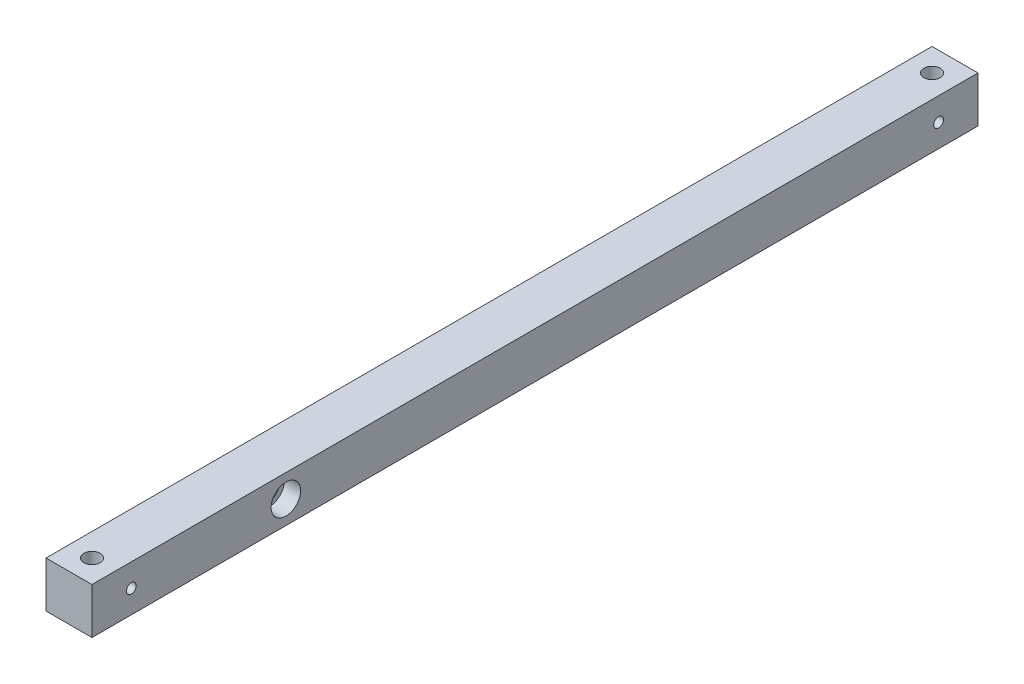
ISO-10303-21;
HEADER;
FILE_DESCRIPTION(('STEP AP214'),'2;1');
FILE_NAME('part.step','',(''),(''),'','','');
FILE_SCHEMA(('AUTOMOTIVE_DESIGN { 1 0 10303 214 1 1 1 1 }'));
ENDSEC;
DATA;
#1=APPLICATION_CONTEXT('core data for automotive mechanical design processes');
#2=APPLICATION_PROTOCOL_DEFINITION('international standard','automotive_design',2000,#1);
#3=PRODUCT_CONTEXT('',#1,'mechanical');
#4=PRODUCT('Part','Part','',(#3));
#5=PRODUCT_RELATED_PRODUCT_CATEGORY('part','',(#4));
#6=PRODUCT_DEFINITION_FORMATION('','',#4);
#7=PRODUCT_DEFINITION_CONTEXT('part definition',#1,'design');
#8=PRODUCT_DEFINITION('design','',#6,#7);
#9=PRODUCT_DEFINITION_SHAPE('','',#8);
#10=(LENGTH_UNIT() NAMED_UNIT(*) SI_UNIT(.MILLI.,.METRE.));
#11=(NAMED_UNIT(*) PLANE_ANGLE_UNIT() SI_UNIT($,.RADIAN.));
#12=(NAMED_UNIT(*) SI_UNIT($,.STERADIAN.) SOLID_ANGLE_UNIT());
#13=UNCERTAINTY_MEASURE_WITH_UNIT(LENGTH_MEASURE(1.E-05),#10,'distance_accuracy_value','');
#14=(GEOMETRIC_REPRESENTATION_CONTEXT(3) GLOBAL_UNCERTAINTY_ASSIGNED_CONTEXT((#13)) GLOBAL_UNIT_ASSIGNED_CONTEXT((#10,
#11,#12)) REPRESENTATION_CONTEXT('',''));
#15=CARTESIAN_POINT('',(0.,0.,0.));
#16=DIRECTION('',(0.,0.,1.));
#17=DIRECTION('',(1.,0.,0.));
#18=AXIS2_PLACEMENT_3D('',#15,#16,#17);
#19=CARTESIAN_POINT('',(-14.001,0.,246.));
#20=DIRECTION('',(1.,0.,0.));
#21=DIRECTION('',(0.,0.,-1.));
#22=AXIS2_PLACEMENT_3D('',#19,#20,#21);
#23=CYLINDRICAL_SURFACE('',#22,3.00000000000005);
#24=CARTESIAN_POINT('',(14.,0.,246.));
#25=DIRECTION('',(1.,0.,0.));
#26=DIRECTION('',(0.,0.,-1.));
#27=AXIS2_PLACEMENT_3D('',#24,#25,#26);
#28=CIRCLE('',#27,3.00000000000005);
#29=CARTESIAN_POINT('',(14.,0.,243.));
#30=VERTEX_POINT('',#29);
#31=EDGE_CURVE('E133',#30,#30,#28,.T.);
#32=ORIENTED_EDGE('',*,*,#31,.T.);
#33=EDGE_LOOP('',(#32));
#34=FACE_BOUND('',#33,.T.);
#35=CARTESIAN_POINT('',(-7.,0.,246.));
#36=DIRECTION('',(-1.,0.,0.));
#37=DIRECTION('',(0.,0.,1.));
#38=AXIS2_PLACEMENT_3D('',#35,#36,#37);
#39=CIRCLE('',#38,3.00000000000005);
#40=CARTESIAN_POINT('',(-7.,0.,249.));
#41=VERTEX_POINT('',#40);
#42=EDGE_CURVE('E130',#41,#41,#39,.F.);
#43=ORIENTED_EDGE('',*,*,#42,.F.);
#44=EDGE_LOOP('',(#43));
#45=FACE_BOUND('',#44,.T.);
#46=ADVANCED_FACE('F35',(#34,#45),#23,.F.);
#47=CARTESIAN_POINT('',(-14.001,0.,-246.));
#48=DIRECTION('',(1.,0.,0.));
#49=DIRECTION('',(0.,0.,-1.));
#50=AXIS2_PLACEMENT_3D('',#47,#48,#49);
#51=CYLINDRICAL_SURFACE('',#50,2.99999999999999);
#52=CARTESIAN_POINT('',(14.,0.,-246.));
#53=DIRECTION('',(1.,0.,0.));
#54=DIRECTION('',(0.,0.,-1.));
#55=AXIS2_PLACEMENT_3D('',#52,#53,#54);
#56=CIRCLE('',#55,2.99999999999999);
#57=CARTESIAN_POINT('',(14.,0.,-249.));
#58=VERTEX_POINT('',#57);
#59=EDGE_CURVE('E137',#58,#58,#56,.T.);
#60=ORIENTED_EDGE('',*,*,#59,.T.);
#61=EDGE_LOOP('',(#60));
#62=FACE_BOUND('',#61,.T.);
#63=CARTESIAN_POINT('',(-7.,0.,-246.));
#64=DIRECTION('',(-1.,0.,0.));
#65=DIRECTION('',(0.,0.,1.));
#66=AXIS2_PLACEMENT_3D('',#63,#64,#65);
#67=CIRCLE('',#66,2.99999999999999);
#68=CARTESIAN_POINT('',(-7.,0.,-243.));
#69=VERTEX_POINT('',#68);
#70=EDGE_CURVE('E128',#69,#69,#67,.F.);
#71=ORIENTED_EDGE('',*,*,#70,.F.);
#72=EDGE_LOOP('',(#71));
#73=FACE_BOUND('',#72,.T.);
#74=ADVANCED_FACE('F183',(#62,#73),#51,.F.);
#75=CARTESIAN_POINT('',(-14.,0.,151.8));
#76=DIRECTION('',(1.,0.,0.));
#77=DIRECTION('',(0.,0.,-1.));
#78=AXIS2_PLACEMENT_3D('',#75,#76,#77);
#79=CYLINDRICAL_SURFACE('',#78,5.99999999999999);
#80=CARTESIAN_POINT('',(-14.,0.,151.8));
#81=DIRECTION('',(1.,0.,0.));
#82=DIRECTION('',(0.,0.,-1.));
#83=AXIS2_PLACEMENT_3D('',#80,#81,#82);
#84=CIRCLE('',#83,5.99999999999999);
#85=CARTESIAN_POINT('',(-14.,0.,145.8));
#86=VERTEX_POINT('',#85);
#87=EDGE_CURVE('E126',#86,#86,#84,.T.);
#88=ORIENTED_EDGE('',*,*,#87,.F.);
#89=EDGE_LOOP('',(#88));
#90=FACE_BOUND('',#89,.T.);
#91=CARTESIAN_POINT('',(4.,0.,151.8));
#92=DIRECTION('',(1.,0.,0.));
#93=DIRECTION('',(0.,0.,-1.));
#94=AXIS2_PLACEMENT_3D('',#91,#92,#93);
#95=CIRCLE('',#94,5.99999999999999);
#96=CARTESIAN_POINT('',(4.,0.,145.8));
#97=VERTEX_POINT('',#96);
#98=EDGE_CURVE('E123',#97,#97,#95,.F.);
#99=ORIENTED_EDGE('',*,*,#98,.F.);
#100=EDGE_LOOP('',(#99));
#101=FACE_BOUND('',#100,.T.);
#102=ADVANCED_FACE('F179',(#90,#101),#79,.F.);
#103=CARTESIAN_POINT('',(14.,-14.,270.));
#104=DIRECTION('',(-1.,0.,0.));
#105=DIRECTION('',(0.,0.,1.));
#106=AXIS2_PLACEMENT_3D('',#103,#104,#105);
#107=PLANE('',#106);
#108=ORIENTED_EDGE('',*,*,#59,.F.);
#109=EDGE_LOOP('',(#108));
#110=FACE_BOUND('',#109,.T.);
#111=ORIENTED_EDGE('',*,*,#31,.F.);
#112=EDGE_LOOP('',(#111));
#113=FACE_BOUND('',#112,.T.);
#114=CARTESIAN_POINT('',(14.,0.,151.8));
#115=DIRECTION('',(1.,0.,0.));
#116=DIRECTION('',(0.,0.,-1.));
#117=AXIS2_PLACEMENT_3D('',#114,#115,#116);
#118=CIRCLE('',#117,8.99999999999998);
#119=CARTESIAN_POINT('',(14.,0.,142.8));
#120=VERTEX_POINT('',#119);
#121=EDGE_CURVE('E142',#120,#120,#118,.T.);
#122=ORIENTED_EDGE('',*,*,#121,.F.);
#123=EDGE_LOOP('',(#122));
#124=FACE_BOUND('',#123,.T.);
#125=DIRECTION('',(0.,1.,0.));
#126=VECTOR('',#125,1.);
#127=CARTESIAN_POINT('',(14.,-14.,-270.));
#128=LINE('',#127,#126);
#129=CARTESIAN_POINT('',(14.,-14.,-270.));
#130=VERTEX_POINT('',#129);
#131=CARTESIAN_POINT('',(14.,14.,-270.));
#132=VERTEX_POINT('',#131);
#133=EDGE_CURVE('E106',#130,#132,#128,.T.);
#134=ORIENTED_EDGE('',*,*,#133,.T.);
#135=DIRECTION('',(0.,0.,-1.));
#136=VECTOR('',#135,1.);
#137=CARTESIAN_POINT('',(14.,14.,270.));
#138=LINE('',#137,#136);
#139=CARTESIAN_POINT('',(14.,14.,270.));
#140=VERTEX_POINT('',#139);
#141=EDGE_CURVE('E11',#140,#132,#138,.T.);
#142=ORIENTED_EDGE('',*,*,#141,.F.);
#143=DIRECTION('',(0.,1.,0.));
#144=VECTOR('',#143,1.);
#145=CARTESIAN_POINT('',(14.,-14.,270.));
#146=LINE('',#145,#144);
#147=CARTESIAN_POINT('',(14.,-14.,270.));
#148=VERTEX_POINT('',#147);
#149=EDGE_CURVE('E93',#148,#140,#146,.T.);
#150=ORIENTED_EDGE('',*,*,#149,.F.);
#151=DIRECTION('',(0.,0.,-1.));
#152=VECTOR('',#151,1.);
#153=CARTESIAN_POINT('',(14.,-14.,270.));
#154=LINE('',#153,#152);
#155=EDGE_CURVE('E102',#148,#130,#154,.T.);
#156=ORIENTED_EDGE('',*,*,#155,.T.);
#157=EDGE_LOOP('',(#134,#142,#150,#156));
#158=FACE_BOUND('',#157,.T.);
#159=ADVANCED_FACE('F37',(#110,#113,#124,#158),#107,.F.);
#160=CARTESIAN_POINT('',(-14.,14.,270.));
#161=DIRECTION('',(0.,-1.,0.));
#162=DIRECTION('',(0.,0.,-1.));
#163=AXIS2_PLACEMENT_3D('',#160,#161,#162);
#164=PLANE('',#163);
#165=CARTESIAN_POINT('',(0.,14.,-256.));
#166=DIRECTION('',(0.,1.,0.));
#167=DIRECTION('',(0.,0.,1.));
#168=AXIS2_PLACEMENT_3D('',#165,#166,#167);
#169=CIRCLE('',#168,5.00000000000001);
#170=CARTESIAN_POINT('',(0.,14.,-251.));
#171=VERTEX_POINT('',#170);
#172=EDGE_CURVE('E159',#171,#171,#169,.T.);
#173=ORIENTED_EDGE('',*,*,#172,.F.);
#174=EDGE_LOOP('',(#173));
#175=FACE_BOUND('',#174,.T.);
#176=CARTESIAN_POINT('',(0.,14.,256.));
#177=DIRECTION('',(0.,1.,0.));
#178=DIRECTION('',(0.,0.,1.));
#179=AXIS2_PLACEMENT_3D('',#176,#177,#178);
#180=CIRCLE('',#179,5.00000000000001);
#181=CARTESIAN_POINT('',(0.,14.,261.));
#182=VERTEX_POINT('',#181);
#183=EDGE_CURVE('E122',#182,#182,#180,.T.);
#184=ORIENTED_EDGE('',*,*,#183,.F.);
#185=EDGE_LOOP('',(#184));
#186=FACE_BOUND('',#185,.T.);
#187=DIRECTION('',(-1.,0.,0.));
#188=VECTOR('',#187,1.);
#189=CARTESIAN_POINT('',(-14.,14.,-270.));
#190=LINE('',#189,#188);
#191=CARTESIAN_POINT('',(-14.,14.,-270.));
#192=VERTEX_POINT('',#191);
#193=EDGE_CURVE('E97',#132,#192,#190,.T.);
#194=ORIENTED_EDGE('',*,*,#193,.T.);
#195=DIRECTION('',(0.,0.,-1.));
#196=VECTOR('',#195,1.);
#197=CARTESIAN_POINT('',(-14.,14.,270.));
#198=LINE('',#197,#196);
#199=CARTESIAN_POINT('',(-14.,14.,270.));
#200=VERTEX_POINT('',#199);
#201=EDGE_CURVE('E49',#200,#192,#198,.T.);
#202=ORIENTED_EDGE('',*,*,#201,.F.);
#203=DIRECTION('',(-1.,0.,0.));
#204=VECTOR('',#203,1.);
#205=CARTESIAN_POINT('',(-14.,14.,270.));
#206=LINE('',#205,#204);
#207=EDGE_CURVE('E88',#140,#200,#206,.T.);
#208=ORIENTED_EDGE('',*,*,#207,.F.);
#209=ORIENTED_EDGE('',*,*,#141,.T.);
#210=EDGE_LOOP('',(#194,#202,#208,#209));
#211=FACE_BOUND('',#210,.T.);
#212=ADVANCED_FACE('F96',(#175,#186,#211),#164,.F.);
#213=CARTESIAN_POINT('',(-14.,-14.,270.));
#214=DIRECTION('',(1.,0.,0.));
#215=DIRECTION('',(0.,0.,-1.));
#216=AXIS2_PLACEMENT_3D('',#213,#214,#215);
#217=PLANE('',#216);
#218=CARTESIAN_POINT('',(-14.,0.,116.8));
#219=DIRECTION('',(-1.,0.,0.));
#220=DIRECTION('',(0.,0.,1.));
#221=AXIS2_PLACEMENT_3D('',#218,#219,#220);
#222=CIRCLE('',#221,6.);
#223=CARTESIAN_POINT('',(-14.,0.,122.8));
#224=VERTEX_POINT('',#223);
#225=EDGE_CURVE('E262',#224,#224,#222,.T.);
#226=ORIENTED_EDGE('',*,*,#225,.F.);
#227=EDGE_LOOP('',(#226));
#228=FACE_BOUND('',#227,.T.);
#229=CARTESIAN_POINT('',(-14.,0.,246.));
#230=DIRECTION('',(-1.,0.,0.));
#231=DIRECTION('',(0.,0.,1.));
#232=AXIS2_PLACEMENT_3D('',#229,#230,#231);
#233=CIRCLE('',#232,5.00000000000002);
#234=CARTESIAN_POINT('',(-14.,0.,251.));
#235=VERTEX_POINT('',#234);
#236=EDGE_CURVE('E268',#235,#235,#233,.T.);
#237=ORIENTED_EDGE('',*,*,#236,.F.);
#238=EDGE_LOOP('',(#237));
#239=FACE_BOUND('',#238,.T.);
#240=CARTESIAN_POINT('',(-14.,0.,-246.));
#241=DIRECTION('',(-1.,0.,0.));
#242=DIRECTION('',(0.,0.,1.));
#243=AXIS2_PLACEMENT_3D('',#240,#241,#242);
#244=CIRCLE('',#243,4.99999999999999);
#245=CARTESIAN_POINT('',(-14.,0.,-241.));
#246=VERTEX_POINT('',#245);
#247=EDGE_CURVE('E273',#246,#246,#244,.T.);
#248=ORIENTED_EDGE('',*,*,#247,.F.);
#249=EDGE_LOOP('',(#248));
#250=FACE_BOUND('',#249,.T.);
#251=ORIENTED_EDGE('',*,*,#87,.T.);
#252=EDGE_LOOP('',(#251));
#253=FACE_BOUND('',#252,.T.);
#254=DIRECTION('',(0.,-1.,0.));
#255=VECTOR('',#254,1.);
#256=CARTESIAN_POINT('',(-14.,-14.,-270.));
#257=LINE('',#256,#255);
#258=CARTESIAN_POINT('',(-14.,-14.,-270.));
#259=VERTEX_POINT('',#258);
#260=EDGE_CURVE('E75',#192,#259,#257,.T.);
#261=ORIENTED_EDGE('',*,*,#260,.T.);
#262=DIRECTION('',(0.,0.,-1.));
#263=VECTOR('',#262,1.);
#264=CARTESIAN_POINT('',(-14.,-14.,270.));
#265=LINE('',#264,#263);
#266=CARTESIAN_POINT('',(-14.,-14.,270.));
#267=VERTEX_POINT('',#266);
#268=EDGE_CURVE('E98',#267,#259,#265,.T.);
#269=ORIENTED_EDGE('',*,*,#268,.F.);
#270=DIRECTION('',(0.,-1.,0.));
#271=VECTOR('',#270,1.);
#272=CARTESIAN_POINT('',(-14.,-14.,270.));
#273=LINE('',#272,#271);
#274=EDGE_CURVE('E91',#200,#267,#273,.T.);
#275=ORIENTED_EDGE('',*,*,#274,.F.);
#276=ORIENTED_EDGE('',*,*,#201,.T.);
#277=EDGE_LOOP('',(#261,#269,#275,#276));
#278=FACE_BOUND('',#277,.T.);
#279=ADVANCED_FACE('F100',(#228,#239,#250,#253,#278),#217,.F.);
#280=CARTESIAN_POINT('',(-14.,-14.,270.));
#281=DIRECTION('',(0.,1.,0.));
#282=DIRECTION('',(0.,0.,1.));
#283=AXIS2_PLACEMENT_3D('',#280,#281,#282);
#284=PLANE('',#283);
#285=CARTESIAN_POINT('',(-2.,-14.,116.8));
#286=DIRECTION('',(0.,-1.,0.));
#287=DIRECTION('',(0.,0.,-1.));
#288=AXIS2_PLACEMENT_3D('',#285,#286,#287);
#289=CIRCLE('',#288,2.5);
#290=CARTESIAN_POINT('',(-2.,-14.,114.3));
#291=VERTEX_POINT('',#290);
#292=EDGE_CURVE('E241',#291,#291,#289,.T.);
#293=ORIENTED_EDGE('',*,*,#292,.F.);
#294=EDGE_LOOP('',(#293));
#295=FACE_BOUND('',#294,.T.);
#296=CARTESIAN_POINT('',(0.,-14.,193.8));
#297=DIRECTION('',(0.,-1.,0.));
#298=DIRECTION('',(0.,0.,-1.));
#299=AXIS2_PLACEMENT_3D('',#296,#297,#298);
#300=CIRCLE('',#299,3.);
#301=CARTESIAN_POINT('',(0.,-14.,190.8));
#302=VERTEX_POINT('',#301);
#303=EDGE_CURVE('E245',#302,#302,#300,.T.);
#304=ORIENTED_EDGE('',*,*,#303,.F.);
#305=EDGE_LOOP('',(#304));
#306=FACE_BOUND('',#305,.T.);
#307=CARTESIAN_POINT('',(0.,-14.,106.8));
#308=DIRECTION('',(0.,-1.,0.));
#309=DIRECTION('',(0.,0.,-1.));
#310=AXIS2_PLACEMENT_3D('',#307,#308,#309);
#311=CIRCLE('',#310,3.);
#312=CARTESIAN_POINT('',(0.,-14.,103.8));
#313=VERTEX_POINT('',#312);
#314=EDGE_CURVE('E249',#313,#313,#311,.T.);
#315=ORIENTED_EDGE('',*,*,#314,.F.);
#316=EDGE_LOOP('',(#315));
#317=FACE_BOUND('',#316,.T.);
#318=CARTESIAN_POINT('',(0.,-14.,256.));
#319=DIRECTION('',(0.,1.,0.));
#320=DIRECTION('',(0.,0.,1.));
#321=AXIS2_PLACEMENT_3D('',#318,#319,#320);
#322=CIRCLE('',#321,3.);
#323=CARTESIAN_POINT('',(0.,-14.,259.));
#324=VERTEX_POINT('',#323);
#325=EDGE_CURVE('E119',#324,#324,#322,.T.);
#326=ORIENTED_EDGE('',*,*,#325,.T.);
#327=EDGE_LOOP('',(#326));
#328=FACE_BOUND('',#327,.T.);
#329=CARTESIAN_POINT('',(0.,-14.,-256.));
#330=DIRECTION('',(0.,1.,0.));
#331=DIRECTION('',(0.,0.,1.));
#332=AXIS2_PLACEMENT_3D('',#329,#330,#331);
#333=CIRCLE('',#332,3.);
#334=CARTESIAN_POINT('',(0.,-14.,-253.));
#335=VERTEX_POINT('',#334);
#336=EDGE_CURVE('E152',#335,#335,#333,.T.);
#337=ORIENTED_EDGE('',*,*,#336,.T.);
#338=EDGE_LOOP('',(#337));
#339=FACE_BOUND('',#338,.T.);
#340=DIRECTION('',(1.,0.,0.));
#341=VECTOR('',#340,1.);
#342=CARTESIAN_POINT('',(-14.,-14.,-270.));
#343=LINE('',#342,#341);
#344=EDGE_CURVE('E81',#259,#130,#343,.T.);
#345=ORIENTED_EDGE('',*,*,#344,.T.);
#346=ORIENTED_EDGE('',*,*,#155,.F.);
#347=DIRECTION('',(1.,0.,0.));
#348=VECTOR('',#347,1.);
#349=CARTESIAN_POINT('',(-14.,-14.,270.));
#350=LINE('',#349,#348);
#351=EDGE_CURVE('E58',#267,#148,#350,.T.);
#352=ORIENTED_EDGE('',*,*,#351,.F.);
#353=ORIENTED_EDGE('',*,*,#268,.T.);
#354=EDGE_LOOP('',(#345,#346,#352,#353));
#355=FACE_BOUND('',#354,.T.);
#356=ADVANCED_FACE('F176',(#295,#306,#317,#328,#339,#355),#284,.F.);
#357=CARTESIAN_POINT('',(0.,0.,270.));
#358=DIRECTION('',(0.,0.,-1.));
#359=DIRECTION('',(-1.,0.,0.));
#360=AXIS2_PLACEMENT_3D('',#357,#358,#359);
#361=PLANE('',#360);
#362=ORIENTED_EDGE('',*,*,#149,.T.);
#363=ORIENTED_EDGE('',*,*,#207,.T.);
#364=ORIENTED_EDGE('',*,*,#274,.T.);
#365=ORIENTED_EDGE('',*,*,#351,.T.);
#366=EDGE_LOOP('',(#362,#363,#364,#365));
#367=FACE_BOUND('',#366,.T.);
#368=ADVANCED_FACE('F89',(#367),#361,.F.);
#369=CARTESIAN_POINT('',(0.,0.,-270.));
#370=DIRECTION('',(0.,0.,-1.));
#371=DIRECTION('',(-1.,0.,0.));
#372=AXIS2_PLACEMENT_3D('',#369,#370,#371);
#373=PLANE('',#372);
#374=ORIENTED_EDGE('',*,*,#133,.F.);
#375=ORIENTED_EDGE('',*,*,#344,.F.);
#376=ORIENTED_EDGE('',*,*,#260,.F.);
#377=ORIENTED_EDGE('',*,*,#193,.F.);
#378=EDGE_LOOP('',(#374,#375,#376,#377));
#379=FACE_BOUND('',#378,.T.);
#380=ADVANCED_FACE('F227',(#379),#373,.T.);
#381=CARTESIAN_POINT('',(0.,7.,256.));
#382=DIRECTION('',(0.,1.,0.));
#383=DIRECTION('',(0.,0.,1.));
#384=AXIS2_PLACEMENT_3D('',#381,#382,#383);
#385=CYLINDRICAL_SURFACE('',#384,5.00000000000001);
#386=CARTESIAN_POINT('',(0.,7.,256.));
#387=DIRECTION('',(0.,1.,0.));
#388=DIRECTION('',(0.,0.,1.));
#389=AXIS2_PLACEMENT_3D('',#386,#387,#388);
#390=CIRCLE('',#389,5.00000000000001);
#391=CARTESIAN_POINT('',(0.,7.,261.));
#392=VERTEX_POINT('',#391);
#393=EDGE_CURVE('E162',#392,#392,#390,.T.);
#394=ORIENTED_EDGE('',*,*,#393,.F.);
#395=EDGE_LOOP('',(#394));
#396=FACE_BOUND('',#395,.T.);
#397=ORIENTED_EDGE('',*,*,#183,.T.);
#398=EDGE_LOOP('',(#397));
#399=FACE_BOUND('',#398,.T.);
#400=ADVANCED_FACE('F168',(#396,#399),#385,.F.);
#401=CARTESIAN_POINT('',(0.,7.,256.));
#402=DIRECTION('',(0.,1.,0.));
#403=DIRECTION('',(0.,0.,1.));
#404=AXIS2_PLACEMENT_3D('',#401,#402,#403);
#405=PLANE('',#404);
#406=CARTESIAN_POINT('',(0.,7.,256.));
#407=DIRECTION('',(0.,1.,0.));
#408=DIRECTION('',(0.,0.,1.));
#409=AXIS2_PLACEMENT_3D('',#406,#407,#408);
#410=CIRCLE('',#409,3.);
#411=CARTESIAN_POINT('',(0.,7.,259.));
#412=VERTEX_POINT('',#411);
#413=EDGE_CURVE('E118',#412,#412,#410,.T.);
#414=ORIENTED_EDGE('',*,*,#413,.F.);
#415=EDGE_LOOP('',(#414));
#416=FACE_BOUND('',#415,.T.);
#417=ORIENTED_EDGE('',*,*,#393,.T.);
#418=EDGE_LOOP('',(#417));
#419=FACE_BOUND('',#418,.T.);
#420=ADVANCED_FACE('F220',(#416,#419),#405,.T.);
#421=CARTESIAN_POINT('',(0.,7.,-256.));
#422=DIRECTION('',(0.,1.,0.));
#423=DIRECTION('',(0.,0.,1.));
#424=AXIS2_PLACEMENT_3D('',#421,#422,#423);
#425=CYLINDRICAL_SURFACE('',#424,5.00000000000001);
#426=CARTESIAN_POINT('',(0.,7.,-256.));
#427=DIRECTION('',(0.,1.,0.));
#428=DIRECTION('',(0.,0.,1.));
#429=AXIS2_PLACEMENT_3D('',#426,#427,#428);
#430=CIRCLE('',#429,5.00000000000001);
#431=CARTESIAN_POINT('',(0.,7.,-251.));
#432=VERTEX_POINT('',#431);
#433=EDGE_CURVE('E109',#432,#432,#430,.T.);
#434=ORIENTED_EDGE('',*,*,#433,.F.);
#435=EDGE_LOOP('',(#434));
#436=FACE_BOUND('',#435,.T.);
#437=ORIENTED_EDGE('',*,*,#172,.T.);
#438=EDGE_LOOP('',(#437));
#439=FACE_BOUND('',#438,.T.);
#440=ADVANCED_FACE('F216',(#436,#439),#425,.F.);
#441=CARTESIAN_POINT('',(0.,7.,-256.));
#442=DIRECTION('',(0.,1.,0.));
#443=DIRECTION('',(0.,0.,1.));
#444=AXIS2_PLACEMENT_3D('',#441,#442,#443);
#445=PLANE('',#444);
#446=CARTESIAN_POINT('',(0.,7.,-256.));
#447=DIRECTION('',(0.,1.,0.));
#448=DIRECTION('',(0.,0.,1.));
#449=AXIS2_PLACEMENT_3D('',#446,#447,#448);
#450=CIRCLE('',#449,3.);
#451=CARTESIAN_POINT('',(0.,7.,-253.));
#452=VERTEX_POINT('',#451);
#453=EDGE_CURVE('E115',#452,#452,#450,.T.);
#454=ORIENTED_EDGE('',*,*,#453,.F.);
#455=EDGE_LOOP('',(#454));
#456=FACE_BOUND('',#455,.T.);
#457=ORIENTED_EDGE('',*,*,#433,.T.);
#458=EDGE_LOOP('',(#457));
#459=FACE_BOUND('',#458,.T.);
#460=ADVANCED_FACE('F212',(#456,#459),#445,.T.);
#461=CARTESIAN_POINT('',(0.,-14.,-256.));
#462=DIRECTION('',(0.,1.,0.));
#463=DIRECTION('',(0.,0.,1.));
#464=AXIS2_PLACEMENT_3D('',#461,#462,#463);
#465=CYLINDRICAL_SURFACE('',#464,3.);
#466=ORIENTED_EDGE('',*,*,#453,.T.);
#467=EDGE_LOOP('',(#466));
#468=FACE_BOUND('',#467,.T.);
#469=ORIENTED_EDGE('',*,*,#336,.F.);
#470=EDGE_LOOP('',(#469));
#471=FACE_BOUND('',#470,.T.);
#472=ADVANCED_FACE('F208',(#468,#471),#465,.F.);
#473=CARTESIAN_POINT('',(0.,-14.,256.));
#474=DIRECTION('',(0.,1.,0.));
#475=DIRECTION('',(0.,0.,1.));
#476=AXIS2_PLACEMENT_3D('',#473,#474,#475);
#477=CYLINDRICAL_SURFACE('',#476,3.);
#478=ORIENTED_EDGE('',*,*,#413,.T.);
#479=EDGE_LOOP('',(#478));
#480=FACE_BOUND('',#479,.T.);
#481=ORIENTED_EDGE('',*,*,#325,.F.);
#482=EDGE_LOOP('',(#481));
#483=FACE_BOUND('',#482,.T.);
#484=ADVANCED_FACE('F197',(#480,#483),#477,.F.);
#485=CARTESIAN_POINT('',(4.,0.,151.8));
#486=DIRECTION('',(1.,0.,0.));
#487=DIRECTION('',(0.,0.,-1.));
#488=AXIS2_PLACEMENT_3D('',#485,#486,#487);
#489=PLANE('',#488);
#490=CARTESIAN_POINT('',(4.,0.,151.8));
#491=DIRECTION('',(1.,0.,0.));
#492=DIRECTION('',(0.,0.,-1.));
#493=AXIS2_PLACEMENT_3D('',#490,#491,#492);
#494=CIRCLE('',#493,8.99999999999998);
#495=CARTESIAN_POINT('',(4.,0.,142.8));
#496=VERTEX_POINT('',#495);
#497=EDGE_CURVE('E127',#496,#496,#494,.T.);
#498=ORIENTED_EDGE('',*,*,#497,.T.);
#499=EDGE_LOOP('',(#498));
#500=FACE_BOUND('',#499,.T.);
#501=ORIENTED_EDGE('',*,*,#98,.T.);
#502=EDGE_LOOP('',(#501));
#503=FACE_BOUND('',#502,.T.);
#504=ADVANCED_FACE('F193',(#500,#503),#489,.T.);
#505=CARTESIAN_POINT('',(4.,0.,151.8));
#506=DIRECTION('',(1.,0.,0.));
#507=DIRECTION('',(0.,0.,-1.));
#508=AXIS2_PLACEMENT_3D('',#505,#506,#507);
#509=CYLINDRICAL_SURFACE('',#508,8.99999999999998);
#510=ORIENTED_EDGE('',*,*,#497,.F.);
#511=EDGE_LOOP('',(#510));
#512=FACE_BOUND('',#511,.T.);
#513=ORIENTED_EDGE('',*,*,#121,.T.);
#514=EDGE_LOOP('',(#513));
#515=FACE_BOUND('',#514,.T.);
#516=ADVANCED_FACE('F196',(#512,#515),#509,.F.);
#517=CARTESIAN_POINT('',(-7.,0.,-246.));
#518=DIRECTION('',(-1.,0.,0.));
#519=DIRECTION('',(0.,0.,1.));
#520=AXIS2_PLACEMENT_3D('',#517,#518,#519);
#521=PLANE('',#520);
#522=CARTESIAN_POINT('',(-7.,0.,-246.));
#523=DIRECTION('',(-1.,0.,0.));
#524=DIRECTION('',(0.,0.,1.));
#525=AXIS2_PLACEMENT_3D('',#522,#523,#524);
#526=CIRCLE('',#525,4.99999999999999);
#527=CARTESIAN_POINT('',(-7.,0.,-241.));
#528=VERTEX_POINT('',#527);
#529=EDGE_CURVE('E271',#528,#528,#526,.T.);
#530=ORIENTED_EDGE('',*,*,#529,.T.);
#531=EDGE_LOOP('',(#530));
#532=FACE_BOUND('',#531,.T.);
#533=ORIENTED_EDGE('',*,*,#70,.T.);
#534=EDGE_LOOP('',(#533));
#535=FACE_BOUND('',#534,.T.);
#536=ADVANCED_FACE('F201',(#532,#535),#521,.T.);
#537=CARTESIAN_POINT('',(-7.,0.,-246.));
#538=DIRECTION('',(-1.,0.,0.));
#539=DIRECTION('',(0.,0.,1.));
#540=AXIS2_PLACEMENT_3D('',#537,#538,#539);
#541=CYLINDRICAL_SURFACE('',#540,4.99999999999999);
#542=ORIENTED_EDGE('',*,*,#529,.F.);
#543=EDGE_LOOP('',(#542));
#544=FACE_BOUND('',#543,.T.);
#545=ORIENTED_EDGE('',*,*,#247,.T.);
#546=EDGE_LOOP('',(#545));
#547=FACE_BOUND('',#546,.T.);
#548=ADVANCED_FACE('F323',(#544,#547),#541,.F.);
#549=CARTESIAN_POINT('',(-7.,0.,246.));
#550=DIRECTION('',(-1.,0.,0.));
#551=DIRECTION('',(0.,0.,1.));
#552=AXIS2_PLACEMENT_3D('',#549,#550,#551);
#553=PLANE('',#552);
#554=CARTESIAN_POINT('',(-7.,0.,246.));
#555=DIRECTION('',(-1.,0.,0.));
#556=DIRECTION('',(0.,0.,1.));
#557=AXIS2_PLACEMENT_3D('',#554,#555,#556);
#558=CIRCLE('',#557,5.00000000000002);
#559=CARTESIAN_POINT('',(-7.,0.,251.));
#560=VERTEX_POINT('',#559);
#561=EDGE_CURVE('E131',#560,#560,#558,.T.);
#562=ORIENTED_EDGE('',*,*,#561,.T.);
#563=EDGE_LOOP('',(#562));
#564=FACE_BOUND('',#563,.T.);
#565=ORIENTED_EDGE('',*,*,#42,.T.);
#566=EDGE_LOOP('',(#565));
#567=FACE_BOUND('',#566,.T.);
#568=ADVANCED_FACE('F320',(#564,#567),#553,.T.);
#569=CARTESIAN_POINT('',(-7.,0.,246.));
#570=DIRECTION('',(-1.,0.,0.));
#571=DIRECTION('',(0.,0.,1.));
#572=AXIS2_PLACEMENT_3D('',#569,#570,#571);
#573=CYLINDRICAL_SURFACE('',#572,5.00000000000002);
#574=ORIENTED_EDGE('',*,*,#561,.F.);
#575=EDGE_LOOP('',(#574));
#576=FACE_BOUND('',#575,.T.);
#577=ORIENTED_EDGE('',*,*,#236,.T.);
#578=EDGE_LOOP('',(#577));
#579=FACE_BOUND('',#578,.T.);
#580=ADVANCED_FACE('F318',(#576,#579),#573,.F.);
#581=CARTESIAN_POINT('',(0.,2.,106.8));
#582=DIRECTION('',(0.,-1.,0.));
#583=DIRECTION('',(0.,0.,-1.));
#584=AXIS2_PLACEMENT_3D('',#581,#582,#583);
#585=CYLINDRICAL_SURFACE('',#584,3.);
#586=CARTESIAN_POINT('',(0.,2.,106.8));
#587=DIRECTION('',(0.,-1.,0.));
#588=DIRECTION('',(0.,0.,-1.));
#589=AXIS2_PLACEMENT_3D('',#586,#587,#588);
#590=CIRCLE('',#589,3.);
#591=CARTESIAN_POINT('',(0.,2.,103.8));
#592=VERTEX_POINT('',#591);
#593=EDGE_CURVE('E256',#592,#592,#590,.T.);
#594=ORIENTED_EDGE('',*,*,#593,.F.);
#595=EDGE_LOOP('',(#594));
#596=FACE_BOUND('',#595,.T.);
#597=ORIENTED_EDGE('',*,*,#314,.T.);
#598=EDGE_LOOP('',(#597));
#599=FACE_BOUND('',#598,.T.);
#600=ADVANCED_FACE('F314',(#596,#599),#585,.F.);
#601=CARTESIAN_POINT('',(0.,2.,106.8));
#602=DIRECTION('',(0.,-1.,0.));
#603=DIRECTION('',(0.,0.,-1.));
#604=AXIS2_PLACEMENT_3D('',#601,#602,#603);
#605=PLANE('',#604);
#606=ORIENTED_EDGE('',*,*,#593,.T.);
#607=EDGE_LOOP('',(#606));
#608=FACE_BOUND('',#607,.T.);
#609=ADVANCED_FACE('F310',(#608),#605,.T.);
#610=CARTESIAN_POINT('',(0.,2.,193.8));
#611=DIRECTION('',(0.,-1.,0.));
#612=DIRECTION('',(0.,0.,-1.));
#613=AXIS2_PLACEMENT_3D('',#610,#611,#612);
#614=CYLINDRICAL_SURFACE('',#613,3.);
#615=CARTESIAN_POINT('',(0.,2.,193.8));
#616=DIRECTION('',(0.,-1.,0.));
#617=DIRECTION('',(0.,0.,-1.));
#618=AXIS2_PLACEMENT_3D('',#615,#616,#617);
#619=CIRCLE('',#618,3.);
#620=CARTESIAN_POINT('',(0.,2.,190.8));
#621=VERTEX_POINT('',#620);
#622=EDGE_CURVE('E275',#621,#621,#619,.T.);
#623=ORIENTED_EDGE('',*,*,#622,.F.);
#624=EDGE_LOOP('',(#623));
#625=FACE_BOUND('',#624,.T.);
#626=ORIENTED_EDGE('',*,*,#303,.T.);
#627=EDGE_LOOP('',(#626));
#628=FACE_BOUND('',#627,.T.);
#629=ADVANCED_FACE('F307',(#625,#628),#614,.F.);
#630=CARTESIAN_POINT('',(0.,2.,193.8));
#631=DIRECTION('',(0.,-1.,0.));
#632=DIRECTION('',(0.,0.,-1.));
#633=AXIS2_PLACEMENT_3D('',#630,#631,#632);
#634=PLANE('',#633);
#635=ORIENTED_EDGE('',*,*,#622,.T.);
#636=EDGE_LOOP('',(#635));
#637=FACE_BOUND('',#636,.T.);
#638=ADVANCED_FACE('F304',(#637),#634,.T.);
#639=CARTESIAN_POINT('',(6.,0.,116.8));
#640=DIRECTION('',(-1.,0.,0.));
#641=DIRECTION('',(0.,0.,1.));
#642=AXIS2_PLACEMENT_3D('',#639,#640,#641);
#643=CYLINDRICAL_SURFACE('',#642,6.);
#644=CARTESIAN_POINT('',(-2.,-5.45435605731786,114.3));
#645=CARTESIAN_POINT('',(-1.9332918168451,-5.45435734054166,114.300001499741));
#646=CARTESIAN_POINT('',(-1.86656520783146,-5.4555854329,114.302675504611));
#647=CARTESIAN_POINT('',(-1.73361352159701,-5.460451257595,114.313335835144));
#648=CARTESIAN_POINT('',(-1.66738876610491,-5.46409042196574,114.321325317898));
#649=CARTESIAN_POINT('',(-1.46994813322944,-5.47848490817198,114.353207340684));
#650=CARTESIAN_POINT('',(-1.34016318357051,-5.49271671920564,114.385013165918));
#651=CARTESIAN_POINT('',(-1.08884523586875,-5.52853615769556,114.468199986624));
#652=CARTESIAN_POINT('',(-0.967280947908397,-5.55009376241033,114.519501185614));
#653=CARTESIAN_POINT('',(-0.734489823443015,-5.59808356001865,114.639987310653));
#654=CARTESIAN_POINT('',(-0.623260550023206,-5.62451459938574,114.709168006235));
#655=CARTESIAN_POINT('',(-0.407346017910576,-5.68111508149861,114.868052215563));
#656=CARTESIAN_POINT('',(-0.303384202952535,-5.71141131571833,114.958693518509));
#657=CARTESIAN_POINT('',(-0.111600234825528,-5.77128595332677,115.155956653633));
#658=CARTESIAN_POINT('',(-0.023784304488851,-5.80086407614999,115.262584618652));
#659=CARTESIAN_POINT('',(0.136899255528637,-5.8575107455344,115.494473210945));
#660=CARTESIAN_POINT('',(0.208953307881459,-5.88441479600862,115.620341412242));
#661=CARTESIAN_POINT('',(0.330551989217485,-5.93113040336416,115.883735955666));
#662=CARTESIAN_POINT('',(0.38010661039742,-5.95094510785638,116.021257090358));
#663=CARTESIAN_POINT('',(0.45267893034036,-5.98035041998162,116.296463003853));
#664=CARTESIAN_POINT('',(0.476943393233222,-5.99041942231785,116.433766847582));
#665=CARTESIAN_POINT('',(0.502275278891982,-6.00093657245547,116.710841639296));
#666=CARTESIAN_POINT('',(0.503352110874229,-6.00138862268062,116.850611563536));
#667=CARTESIAN_POINT('',(0.482931438970794,-5.99290258260449,117.119585560219));
#668=CARTESIAN_POINT('',(0.462803799173118,-5.98453429295767,117.248914977213));
#669=CARTESIAN_POINT('',(0.402893794499093,-5.96013033502178,117.502165787865));
#670=CARTESIAN_POINT('',(0.363109980678849,-5.94409410149732,117.62608678211));
#671=CARTESIAN_POINT('',(0.264543918272477,-5.90559704827471,117.867276236154));
#672=CARTESIAN_POINT('',(0.205481074275769,-5.88304194251415,117.984414354149));
#673=CARTESIAN_POINT('',(0.0703084865819088,-5.83371427980367,118.207423534565));
#674=CARTESIAN_POINT('',(-0.00580728169784426,-5.80694023334947,118.313290595516));
#675=CARTESIAN_POINT('',(-0.17916484080079,-5.74963397551513,118.518681823413));
#676=CARTESIAN_POINT('',(-0.27751758254303,-5.71896988702082,118.617232874623));
#677=CARTESIAN_POINT('',(-0.489422881428128,-5.65875721372882,118.796862829865));
#678=CARTESIAN_POINT('',(-0.602981276635657,-5.62920906299902,118.877934991683));
#679=CARTESIAN_POINT('',(-0.846790073279715,-5.57363224672088,119.022803784971));
#680=CARTESIAN_POINT('',(-0.977466411305491,-5.54775116967603,119.085945066984));
#681=CARTESIAN_POINT('',(-1.24896208976256,-5.50419688296718,119.18892864104));
#682=CARTESIAN_POINT('',(-1.38977409648425,-5.48651780631503,119.228787592512));
#683=CARTESIAN_POINT('',(-1.667793617867,-5.46282425074792,119.281600503392));
#684=CARTESIAN_POINT('',(-1.80464224452852,-5.45612738403682,119.296132292665));
#685=CARTESIAN_POINT('',(-2.07895696481259,-5.45320573611839,119.302512610372));
#686=CARTESIAN_POINT('',(-2.21642282838074,-5.45697733196185,119.294368986361));
#687=CARTESIAN_POINT('',(-2.4787967708634,-5.47386262693795,119.257069551313));
#688=CARTESIAN_POINT('',(-2.60394537357419,-5.48636276033852,119.229292376362));
#689=CARTESIAN_POINT('',(-2.84770259299515,-5.51851260594277,119.155341171284));
#690=CARTESIAN_POINT('',(-2.96630967366157,-5.53816398920152,119.109162841062));
#691=CARTESIAN_POINT('',(-3.19923062071278,-5.58341595714178,118.997550416104));
#692=CARTESIAN_POINT('',(-3.31314994921936,-5.60923324404617,118.931383666124));
#693=CARTESIAN_POINT('',(-3.52881610499933,-5.66360007481535,118.782401568772));
#694=CARTESIAN_POINT('',(-3.63055763340873,-5.69215079841133,118.699579015752));
#695=CARTESIAN_POINT('',(-3.82760026976261,-5.75157239569102,118.511688911431));
#696=CARTESIAN_POINT('',(-3.92170279988034,-5.78244293417774,118.405359322958));
#697=CARTESIAN_POINT('',(-4.09094458397963,-5.84086722367755,118.177703025108));
#698=CARTESIAN_POINT('',(-4.1660824482059,-5.868420731537,118.056375217611));
#699=CARTESIAN_POINT('',(-4.29517975080845,-5.91728503171628,117.801309361603));
#700=CARTESIAN_POINT('',(-4.34908448228482,-5.93857966278875,117.667540339262));
#701=CARTESIAN_POINT('',(-4.43323358496281,-5.9723634620551,117.391717670324));
#702=CARTESIAN_POINT('',(-4.463492037549,-5.98485787035282,117.249669008507));
#703=CARTESIAN_POINT('',(-4.49771625002042,-5.9990306959926,116.97203306696));
#704=CARTESIAN_POINT('',(-4.50337199571005,-6.0014040908376,116.836688169398));
#705=CARTESIAN_POINT('',(-4.49277372109535,-5.99699046946599,116.567026376761));
#706=CARTESIAN_POINT('',(-4.47652354168605,-5.99020505911644,116.432709305623));
#707=CARTESIAN_POINT('',(-4.4237878424573,-5.9686013201843,116.173827034422));
#708=CARTESIAN_POINT('',(-4.38804059052424,-5.95407648620171,116.049084921818));
#709=CARTESIAN_POINT('',(-4.29813155412763,-5.91858999492375,115.807415541493));
#710=CARTESIAN_POINT('',(-4.24396627164176,-5.8976271149635,115.690489763331));
#711=CARTESIAN_POINT('',(-4.11602075242076,-5.85011651583377,115.46195085932));
#712=CARTESIAN_POINT('',(-4.04146467648696,-5.823359213724,115.350816647002));
#713=CARTESIAN_POINT('',(-3.87598635518928,-5.7674312075248,115.142162685781));
#714=CARTESIAN_POINT('',(-3.78505803416388,-5.73825960968077,115.044648014959));
#715=CARTESIAN_POINT('',(-3.58210746992791,-5.67829702479814,114.859100277577));
#716=CARTESIAN_POINT('',(-3.46907088797005,-5.64753091772369,114.772163923006));
#717=CARTESIAN_POINT('',(-3.22909360799927,-5.5899105903639,114.618333924245));
#718=CARTESIAN_POINT('',(-3.10214519133264,-5.56305856115973,114.551451484163));
#719=CARTESIAN_POINT('',(-2.83807106664053,-5.51685287460303,114.440342557358));
#720=CARTESIAN_POINT('',(-2.70100404485043,-5.49745949216625,114.395995627413));
#721=CARTESIAN_POINT('',(-2.49083623093362,-5.47594959049764,114.347600746492));
#722=CARTESIAN_POINT('',(-2.42008940204395,-5.47004503557757,114.334493966522));
#723=CARTESIAN_POINT('',(-2.27757394358142,-5.46095373466209,114.314418690561));
#724=CARTESIAN_POINT('',(-2.20580607207738,-5.45776506941946,114.307445859756));
#725=CARTESIAN_POINT('',(-2.08928839436097,-5.45490391727669,114.301195203292));
#726=CARTESIAN_POINT('',(-2.0446483243266,-5.45435519844583,114.299998996211));
#727=CARTESIAN_POINT('',(-2.,-5.45435605731786,114.3));
#728=B_SPLINE_CURVE_WITH_KNOTS('',3,(#644,#645,#646,#647,#648,#649,#650,#651,#652,#653,#654,
#655,#656,#657,#658,#659,#660,#661,#662,#663,#664,#665,#666,#667,#668,#669,#670,#671,#672,#673,
#674,#675,#676,#677,#678,#679,#680,#681,#682,#683,#684,#685,#686,#687,#688,#689,#690,#691,#692,
#693,#694,#695,#696,#697,#698,#699,#700,#701,#702,#703,#704,#705,#706,#707,#708,#709,#710,#711,
#712,#713,#714,#715,#716,#717,#718,#719,#720,#721,#722,#723,#724,#725,#726,#727),.UNSPECIFIED.,
.T.,.F.,(4,2,2,2,2,2,2,2,2,2,2,2,2,2,2,2,2,2,2,2,2,2,2,2,2,2,2,2,2,2,2,2,2,2,2,2,2,2,2,2,2,4),
(0.,0.200084575093043,0.400288095243579,0.801278994956904,1.20064597557677,1.59991854837275,
2.02172149988563,2.44368668047076,2.88395420283103,3.32402600677039,3.74119679083158,
4.15819828963117,4.54982147617441,4.94147353531023,5.33910096407386,5.73686909172222,
6.16267530816224,6.58864548009988,7.02861558463919,7.46827048625635,7.87940023747112,
8.29038772171394,8.6750626926688,9.05982760961556,9.46088720770835,9.86212068725427,
10.2960179260552,10.7299469521823,11.1649867904569,11.5997673642051,12.004157373226,
12.4084764873832,12.7984529720747,13.1885035639884,13.5961819279257,14.0040118923231,
14.4395932095167,14.8754174341574,15.3088871873109,15.5252058174741,15.7413714538654,
15.8752896716763),.UNSPECIFIED.);
#729=CARTESIAN_POINT('',(-2.,-5.45435605731786,114.3));
#730=VERTEX_POINT('',#729);
#731=EDGE_CURVE('E39',#730,#730,#728,.T.);
#732=ORIENTED_EDGE('',*,*,#731,.T.);
#733=EDGE_LOOP('',(#732));
#734=FACE_BOUND('',#733,.T.);
#735=CARTESIAN_POINT('',(6.,0.,116.8));
#736=DIRECTION('',(-1.,0.,0.));
#737=DIRECTION('',(0.,0.,1.));
#738=AXIS2_PLACEMENT_3D('',#735,#736,#737);
#739=CIRCLE('',#738,6.);
#740=CARTESIAN_POINT('',(6.,0.,122.8));
#741=VERTEX_POINT('',#740);
#742=EDGE_CURVE('E257',#741,#741,#739,.T.);
#743=ORIENTED_EDGE('',*,*,#742,.F.);
#744=EDGE_LOOP('',(#743));
#745=FACE_BOUND('',#744,.T.);
#746=ORIENTED_EDGE('',*,*,#225,.T.);
#747=EDGE_LOOP('',(#746));
#748=FACE_BOUND('',#747,.T.);
#749=ADVANCED_FACE('F289',(#734,#745,#748),#643,.F.);
#750=CARTESIAN_POINT('',(6.,0.,116.8));
#751=DIRECTION('',(-1.,0.,0.));
#752=DIRECTION('',(0.,0.,1.));
#753=AXIS2_PLACEMENT_3D('',#750,#751,#752);
#754=PLANE('',#753);
#755=ORIENTED_EDGE('',*,*,#742,.T.);
#756=EDGE_LOOP('',(#755));
#757=FACE_BOUND('',#756,.T.);
#758=ADVANCED_FACE('F294',(#757),#754,.T.);
#759=CARTESIAN_POINT('',(-2.,-4.,116.8));
#760=DIRECTION('',(0.,-1.,0.));
#761=DIRECTION('',(0.,0.,-1.));
#762=AXIS2_PLACEMENT_3D('',#759,#760,#761);
#763=CYLINDRICAL_SURFACE('',#762,2.5);
#764=ORIENTED_EDGE('',*,*,#292,.T.);
#765=EDGE_LOOP('',(#764));
#766=FACE_BOUND('',#765,.T.);
#767=ORIENTED_EDGE('',*,*,#731,.F.);
#768=EDGE_LOOP('',(#767));
#769=FACE_BOUND('',#768,.T.);
#770=ADVANCED_FACE('F292',(#766,#769),#763,.F.);
#771=CLOSED_SHELL('',(#46,#74,#102,#159,#212,#279,#356,#368,#380,#400,#420,#440,#460,#472,#484,
#504,#516,#536,#548,#568,#580,#600,#609,#629,#638,#749,#758,#770));
#772=MANIFOLD_SOLID_BREP('B2',#771);
#773=ADVANCED_BREP_SHAPE_REPRESENTATION('',(#18,#772),#14);
#774=SHAPE_DEFINITION_REPRESENTATION(#9,#773);
ENDSEC;
END-ISO-10303-21;
